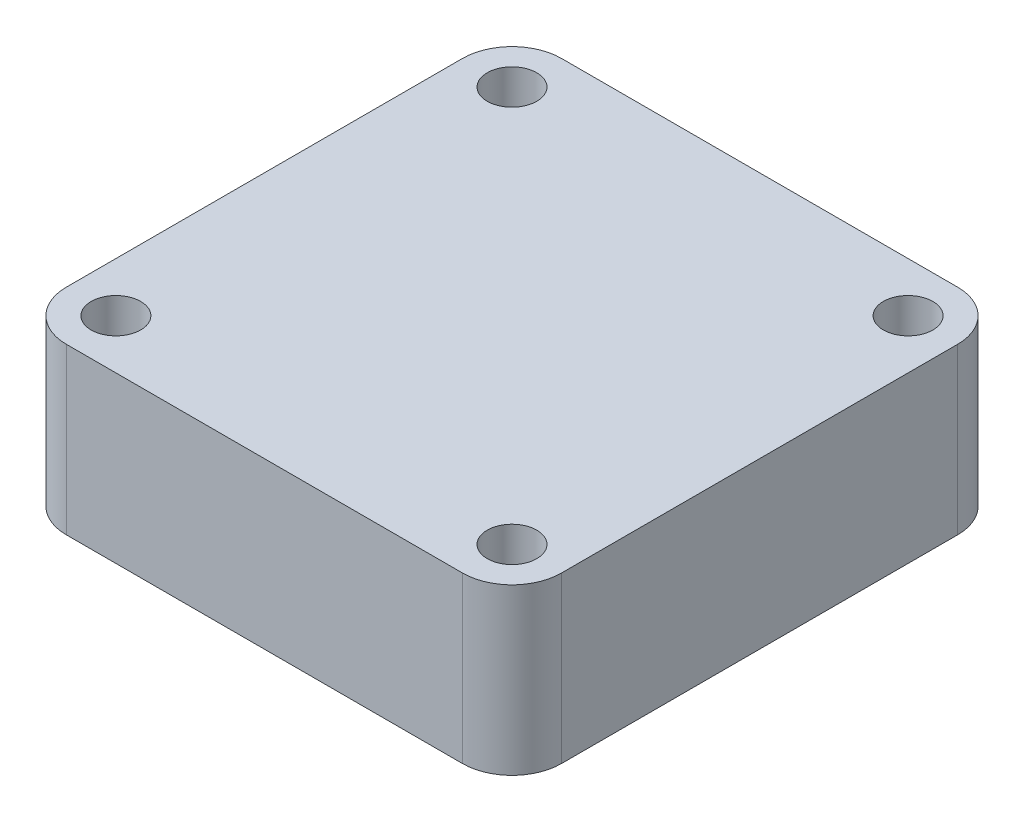
ISO-10303-21;
HEADER;
FILE_DESCRIPTION(('STEP AP214'),'2;1');
FILE_NAME('part.step','',(''),(''),'','','');
FILE_SCHEMA(('AUTOMOTIVE_DESIGN { 1 0 10303 214 1 1 1 1 }'));
ENDSEC;
DATA;
#1=APPLICATION_CONTEXT('core data for automotive mechanical design processes');
#2=APPLICATION_PROTOCOL_DEFINITION('international standard','automotive_design',2000,#1);
#3=PRODUCT_CONTEXT('',#1,'mechanical');
#4=PRODUCT('Part','Part','',(#3));
#5=PRODUCT_RELATED_PRODUCT_CATEGORY('part','',(#4));
#6=PRODUCT_DEFINITION_FORMATION('','',#4);
#7=PRODUCT_DEFINITION_CONTEXT('part definition',#1,'design');
#8=PRODUCT_DEFINITION('design','',#6,#7);
#9=PRODUCT_DEFINITION_SHAPE('','',#8);
#10=(LENGTH_UNIT() NAMED_UNIT(*) SI_UNIT(.MILLI.,.METRE.));
#11=(NAMED_UNIT(*) PLANE_ANGLE_UNIT() SI_UNIT($,.RADIAN.));
#12=(NAMED_UNIT(*) SI_UNIT($,.STERADIAN.) SOLID_ANGLE_UNIT());
#13=UNCERTAINTY_MEASURE_WITH_UNIT(LENGTH_MEASURE(1.E-05),#10,'distance_accuracy_value','');
#14=(GEOMETRIC_REPRESENTATION_CONTEXT(3) GLOBAL_UNCERTAINTY_ASSIGNED_CONTEXT((#13)) GLOBAL_UNIT_ASSIGNED_CONTEXT((#10,
#11,#12)) REPRESENTATION_CONTEXT('',''));
#15=CARTESIAN_POINT('',(0.,0.,0.));
#16=DIRECTION('',(0.,0.,1.));
#17=DIRECTION('',(1.,0.,0.));
#18=AXIS2_PLACEMENT_3D('',#15,#16,#17);
#19=CARTESIAN_POINT('',(0.,10.,0.));
#20=DIRECTION('',(1.,0.,0.));
#21=DIRECTION('',(0.,0.,-1.));
#22=AXIS2_PLACEMENT_3D('',#19,#20,#21);
#23=PLANE('',#22);
#24=DIRECTION('',(0.,0.,1.));
#25=VECTOR('',#24,1.);
#26=CARTESIAN_POINT('',(0.,10.,0.));
#27=LINE('',#26,#25);
#28=CARTESIAN_POINT('',(0.,10.,3.));
#29=VERTEX_POINT('',#28);
#30=CARTESIAN_POINT('',(0.,10.,27.));
#31=VERTEX_POINT('',#30);
#32=EDGE_CURVE('E126',#29,#31,#27,.T.);
#33=ORIENTED_EDGE('',*,*,#32,.F.);
#34=DIRECTION('',(0.,-1.,0.));
#35=VECTOR('',#34,1.);
#36=CARTESIAN_POINT('',(0.,10.,3.));
#37=LINE('',#36,#35);
#38=CARTESIAN_POINT('',(0.,0.,3.));
#39=VERTEX_POINT('',#38);
#40=EDGE_CURVE('E11',#29,#39,#37,.T.);
#41=ORIENTED_EDGE('',*,*,#40,.T.);
#42=DIRECTION('',(0.,0.,1.));
#43=VECTOR('',#42,1.);
#44=CARTESIAN_POINT('',(0.,0.,0.));
#45=LINE('',#44,#43);
#46=CARTESIAN_POINT('',(0.,0.,27.));
#47=VERTEX_POINT('',#46);
#48=EDGE_CURVE('E157',#39,#47,#45,.T.);
#49=ORIENTED_EDGE('',*,*,#48,.T.);
#50=DIRECTION('',(0.,-1.,0.));
#51=VECTOR('',#50,1.);
#52=CARTESIAN_POINT('',(0.,10.,27.));
#53=LINE('',#52,#51);
#54=EDGE_CURVE('E40',#47,#31,#53,.F.);
#55=ORIENTED_EDGE('',*,*,#54,.T.);
#56=EDGE_LOOP('',(#33,#41,#49,#55));
#57=FACE_BOUND('',#56,.T.);
#58=ADVANCED_FACE('F32',(#57),#23,.F.);
#59=CARTESIAN_POINT('',(0.,10.,30.));
#60=DIRECTION('',(0.,0.,-1.));
#61=DIRECTION('',(-1.,0.,0.));
#62=AXIS2_PLACEMENT_3D('',#59,#60,#61);
#63=PLANE('',#62);
#64=DIRECTION('',(1.,0.,0.));
#65=VECTOR('',#64,1.);
#66=CARTESIAN_POINT('',(0.,0.,30.));
#67=LINE('',#66,#65);
#68=CARTESIAN_POINT('',(3.,0.,30.));
#69=VERTEX_POINT('',#68);
#70=CARTESIAN_POINT('',(27.,0.,30.));
#71=VERTEX_POINT('',#70);
#72=EDGE_CURVE('E131',#69,#71,#67,.T.);
#73=ORIENTED_EDGE('',*,*,#72,.T.);
#74=DIRECTION('',(0.,-1.,0.));
#75=VECTOR('',#74,1.);
#76=CARTESIAN_POINT('',(27.,10.,30.));
#77=LINE('',#76,#75);
#78=CARTESIAN_POINT('',(27.,10.,30.));
#79=VERTEX_POINT('',#78);
#80=EDGE_CURVE('E47',#71,#79,#77,.F.);
#81=ORIENTED_EDGE('',*,*,#80,.T.);
#82=DIRECTION('',(1.,0.,0.));
#83=VECTOR('',#82,1.);
#84=CARTESIAN_POINT('',(0.,10.,30.));
#85=LINE('',#84,#83);
#86=CARTESIAN_POINT('',(3.,10.,30.));
#87=VERTEX_POINT('',#86);
#88=EDGE_CURVE('E129',#87,#79,#85,.T.);
#89=ORIENTED_EDGE('',*,*,#88,.F.);
#90=DIRECTION('',(0.,-1.,0.));
#91=VECTOR('',#90,1.);
#92=CARTESIAN_POINT('',(3.,10.,30.));
#93=LINE('',#92,#91);
#94=EDGE_CURVE('E149',#87,#69,#93,.T.);
#95=ORIENTED_EDGE('',*,*,#94,.T.);
#96=EDGE_LOOP('',(#73,#81,#89,#95));
#97=FACE_BOUND('',#96,.T.);
#98=ADVANCED_FACE('F164',(#97),#63,.F.);
#99=CARTESIAN_POINT('',(30.,10.,0.));
#100=DIRECTION('',(-1.,0.,0.));
#101=DIRECTION('',(0.,0.,1.));
#102=AXIS2_PLACEMENT_3D('',#99,#100,#101);
#103=PLANE('',#102);
#104=DIRECTION('',(0.,0.,-1.));
#105=VECTOR('',#104,1.);
#106=CARTESIAN_POINT('',(30.,0.,0.));
#107=LINE('',#106,#105);
#108=CARTESIAN_POINT('',(30.,0.,27.));
#109=VERTEX_POINT('',#108);
#110=CARTESIAN_POINT('',(30.,0.,3.));
#111=VERTEX_POINT('',#110);
#112=EDGE_CURVE('E127',#109,#111,#107,.T.);
#113=ORIENTED_EDGE('',*,*,#112,.T.);
#114=DIRECTION('',(0.,-1.,0.));
#115=VECTOR('',#114,1.);
#116=CARTESIAN_POINT('',(30.,10.,3.));
#117=LINE('',#116,#115);
#118=CARTESIAN_POINT('',(30.,10.,3.));
#119=VERTEX_POINT('',#118);
#120=EDGE_CURVE('E104',#111,#119,#117,.F.);
#121=ORIENTED_EDGE('',*,*,#120,.T.);
#122=DIRECTION('',(0.,0.,-1.));
#123=VECTOR('',#122,1.);
#124=CARTESIAN_POINT('',(30.,10.,0.));
#125=LINE('',#124,#123);
#126=CARTESIAN_POINT('',(30.,10.,27.));
#127=VERTEX_POINT('',#126);
#128=EDGE_CURVE('E169',#127,#119,#125,.T.);
#129=ORIENTED_EDGE('',*,*,#128,.F.);
#130=DIRECTION('',(0.,-1.,0.));
#131=VECTOR('',#130,1.);
#132=CARTESIAN_POINT('',(30.,10.,27.));
#133=LINE('',#132,#131);
#134=EDGE_CURVE('E109',#127,#109,#133,.T.);
#135=ORIENTED_EDGE('',*,*,#134,.T.);
#136=EDGE_LOOP('',(#113,#121,#129,#135));
#137=FACE_BOUND('',#136,.T.);
#138=ADVANCED_FACE('F232',(#137),#103,.F.);
#139=CARTESIAN_POINT('',(0.,10.,0.));
#140=DIRECTION('',(0.,0.,1.));
#141=DIRECTION('',(1.,0.,0.));
#142=AXIS2_PLACEMENT_3D('',#139,#140,#141);
#143=PLANE('',#142);
#144=DIRECTION('',(-1.,0.,0.));
#145=VECTOR('',#144,1.);
#146=CARTESIAN_POINT('',(0.,10.,0.));
#147=LINE('',#146,#145);
#148=CARTESIAN_POINT('',(27.,10.,0.));
#149=VERTEX_POINT('',#148);
#150=CARTESIAN_POINT('',(3.,10.,0.));
#151=VERTEX_POINT('',#150);
#152=EDGE_CURVE('E119',#149,#151,#147,.T.);
#153=ORIENTED_EDGE('',*,*,#152,.F.);
#154=DIRECTION('',(0.,-1.,0.));
#155=VECTOR('',#154,1.);
#156=CARTESIAN_POINT('',(27.,10.,0.));
#157=LINE('',#156,#155);
#158=CARTESIAN_POINT('',(27.,0.,0.));
#159=VERTEX_POINT('',#158);
#160=EDGE_CURVE('E103',#149,#159,#157,.T.);
#161=ORIENTED_EDGE('',*,*,#160,.T.);
#162=DIRECTION('',(-1.,0.,0.));
#163=VECTOR('',#162,1.);
#164=CARTESIAN_POINT('',(0.,0.,0.));
#165=LINE('',#164,#163);
#166=CARTESIAN_POINT('',(3.,0.,0.));
#167=VERTEX_POINT('',#166);
#168=EDGE_CURVE('E116',#159,#167,#165,.T.);
#169=ORIENTED_EDGE('',*,*,#168,.T.);
#170=DIRECTION('',(0.,-1.,0.));
#171=VECTOR('',#170,1.);
#172=CARTESIAN_POINT('',(3.,10.,0.));
#173=LINE('',#172,#171);
#174=EDGE_CURVE('E121',#167,#151,#173,.F.);
#175=ORIENTED_EDGE('',*,*,#174,.T.);
#176=EDGE_LOOP('',(#153,#161,#169,#175));
#177=FACE_BOUND('',#176,.T.);
#178=ADVANCED_FACE('F115',(#177),#143,.F.);
#179=CARTESIAN_POINT('',(0.,10.,0.));
#180=DIRECTION('',(0.,1.,0.));
#181=DIRECTION('',(0.,0.,1.));
#182=AXIS2_PLACEMENT_3D('',#179,#180,#181);
#183=PLANE('',#182);
#184=CARTESIAN_POINT('',(27.,10.,3.));
#185=DIRECTION('',(0.,1.,0.));
#186=DIRECTION('',(0.,0.,1.));
#187=AXIS2_PLACEMENT_3D('',#184,#185,#186);
#188=CIRCLE('',#187,1.5);
#189=CARTESIAN_POINT('',(27.,10.,4.5));
#190=VERTEX_POINT('',#189);
#191=EDGE_CURVE('E190',#190,#190,#188,.T.);
#192=ORIENTED_EDGE('',*,*,#191,.F.);
#193=EDGE_LOOP('',(#192));
#194=FACE_BOUND('',#193,.T.);
#195=CARTESIAN_POINT('',(27.0000000000002,10.,27.));
#196=DIRECTION('',(0.,1.,0.));
#197=DIRECTION('',(0.,0.,1.));
#198=AXIS2_PLACEMENT_3D('',#195,#196,#197);
#199=CIRCLE('',#198,1.5);
#200=CARTESIAN_POINT('',(27.0000000000002,10.,28.5));
#201=VERTEX_POINT('',#200);
#202=EDGE_CURVE('E184',#201,#201,#199,.T.);
#203=ORIENTED_EDGE('',*,*,#202,.F.);
#204=EDGE_LOOP('',(#203));
#205=FACE_BOUND('',#204,.T.);
#206=CARTESIAN_POINT('',(3.00000000000025,10.,27.));
#207=DIRECTION('',(0.,1.,0.));
#208=DIRECTION('',(0.,0.,1.));
#209=AXIS2_PLACEMENT_3D('',#206,#207,#208);
#210=CIRCLE('',#209,1.5);
#211=CARTESIAN_POINT('',(3.00000000000025,10.,28.5));
#212=VERTEX_POINT('',#211);
#213=EDGE_CURVE('E178',#212,#212,#210,.T.);
#214=ORIENTED_EDGE('',*,*,#213,.F.);
#215=EDGE_LOOP('',(#214));
#216=FACE_BOUND('',#215,.T.);
#217=CARTESIAN_POINT('',(3.,10.,3.));
#218=DIRECTION('',(0.,1.,0.));
#219=DIRECTION('',(0.,0.,1.));
#220=AXIS2_PLACEMENT_3D('',#217,#218,#219);
#221=CIRCLE('',#220,1.5);
#222=CARTESIAN_POINT('',(3.,10.,4.5));
#223=VERTEX_POINT('',#222);
#224=EDGE_CURVE('E172',#223,#223,#221,.T.);
#225=ORIENTED_EDGE('',*,*,#224,.F.);
#226=EDGE_LOOP('',(#225));
#227=FACE_BOUND('',#226,.T.);
#228=ORIENTED_EDGE('',*,*,#128,.T.);
#229=CARTESIAN_POINT('',(27.,10.,3.));
#230=DIRECTION('',(0.,1.,0.));
#231=DIRECTION('',(0.,0.,1.));
#232=AXIS2_PLACEMENT_3D('',#229,#230,#231);
#233=CIRCLE('',#232,3.);
#234=EDGE_CURVE('E147',#119,#149,#233,.T.);
#235=ORIENTED_EDGE('',*,*,#234,.T.);
#236=ORIENTED_EDGE('',*,*,#152,.T.);
#237=CARTESIAN_POINT('',(3.,10.,3.));
#238=DIRECTION('',(0.,1.,0.));
#239=DIRECTION('',(0.,0.,1.));
#240=AXIS2_PLACEMENT_3D('',#237,#238,#239);
#241=CIRCLE('',#240,3.);
#242=EDGE_CURVE('E143',#151,#29,#241,.T.);
#243=ORIENTED_EDGE('',*,*,#242,.T.);
#244=ORIENTED_EDGE('',*,*,#32,.T.);
#245=CARTESIAN_POINT('',(3.,10.,27.));
#246=DIRECTION('',(0.,1.,0.));
#247=DIRECTION('',(0.,0.,1.));
#248=AXIS2_PLACEMENT_3D('',#245,#246,#247);
#249=CIRCLE('',#248,3.);
#250=EDGE_CURVE('E54',#31,#87,#249,.T.);
#251=ORIENTED_EDGE('',*,*,#250,.T.);
#252=ORIENTED_EDGE('',*,*,#88,.T.);
#253=CARTESIAN_POINT('',(27.,10.,27.));
#254=DIRECTION('',(0.,1.,0.));
#255=DIRECTION('',(0.,0.,1.));
#256=AXIS2_PLACEMENT_3D('',#253,#254,#255);
#257=CIRCLE('',#256,3.);
#258=EDGE_CURVE('E145',#79,#127,#257,.T.);
#259=ORIENTED_EDGE('',*,*,#258,.T.);
#260=EDGE_LOOP('',(#228,#235,#236,#243,#244,#251,#252,#259));
#261=FACE_BOUND('',#260,.T.);
#262=ADVANCED_FACE('F160',(#194,#205,#216,#227,#261),#183,.T.);
#263=CARTESIAN_POINT('',(0.,0.,0.));
#264=DIRECTION('',(0.,1.,0.));
#265=DIRECTION('',(0.,0.,1.));
#266=AXIS2_PLACEMENT_3D('',#263,#264,#265);
#267=PLANE('',#266);
#268=CARTESIAN_POINT('',(27.,0.,3.));
#269=DIRECTION('',(0.,1.,0.));
#270=DIRECTION('',(0.,0.,1.));
#271=AXIS2_PLACEMENT_3D('',#268,#269,#270);
#272=CIRCLE('',#271,1.5);
#273=CARTESIAN_POINT('',(27.,0.,4.5));
#274=VERTEX_POINT('',#273);
#275=EDGE_CURVE('E175',#274,#274,#272,.T.);
#276=ORIENTED_EDGE('',*,*,#275,.T.);
#277=EDGE_LOOP('',(#276));
#278=FACE_BOUND('',#277,.T.);
#279=CARTESIAN_POINT('',(27.0000000000002,0.,27.));
#280=DIRECTION('',(0.,1.,0.));
#281=DIRECTION('',(0.,0.,1.));
#282=AXIS2_PLACEMENT_3D('',#279,#280,#281);
#283=CIRCLE('',#282,1.5);
#284=CARTESIAN_POINT('',(27.0000000000002,0.,28.5));
#285=VERTEX_POINT('',#284);
#286=EDGE_CURVE('E187',#285,#285,#283,.T.);
#287=ORIENTED_EDGE('',*,*,#286,.T.);
#288=EDGE_LOOP('',(#287));
#289=FACE_BOUND('',#288,.T.);
#290=CARTESIAN_POINT('',(3.00000000000025,0.,27.));
#291=DIRECTION('',(0.,1.,0.));
#292=DIRECTION('',(0.,0.,1.));
#293=AXIS2_PLACEMENT_3D('',#290,#291,#292);
#294=CIRCLE('',#293,1.5);
#295=CARTESIAN_POINT('',(3.00000000000025,0.,28.5));
#296=VERTEX_POINT('',#295);
#297=EDGE_CURVE('E181',#296,#296,#294,.T.);
#298=ORIENTED_EDGE('',*,*,#297,.T.);
#299=EDGE_LOOP('',(#298));
#300=FACE_BOUND('',#299,.T.);
#301=CARTESIAN_POINT('',(3.,0.,3.));
#302=DIRECTION('',(0.,1.,0.));
#303=DIRECTION('',(0.,0.,1.));
#304=AXIS2_PLACEMENT_3D('',#301,#302,#303);
#305=CIRCLE('',#304,1.5);
#306=CARTESIAN_POINT('',(3.,0.,4.5));
#307=VERTEX_POINT('',#306);
#308=EDGE_CURVE('E165',#307,#307,#305,.T.);
#309=ORIENTED_EDGE('',*,*,#308,.T.);
#310=EDGE_LOOP('',(#309));
#311=FACE_BOUND('',#310,.T.);
#312=ORIENTED_EDGE('',*,*,#168,.F.);
#313=CARTESIAN_POINT('',(27.,0.,3.));
#314=DIRECTION('',(0.,1.,0.));
#315=DIRECTION('',(0.,0.,1.));
#316=AXIS2_PLACEMENT_3D('',#313,#314,#315);
#317=CIRCLE('',#316,3.);
#318=EDGE_CURVE('E99',#159,#111,#317,.F.);
#319=ORIENTED_EDGE('',*,*,#318,.T.);
#320=ORIENTED_EDGE('',*,*,#112,.F.);
#321=CARTESIAN_POINT('',(27.,0.,27.));
#322=DIRECTION('',(0.,1.,0.));
#323=DIRECTION('',(0.,0.,1.));
#324=AXIS2_PLACEMENT_3D('',#321,#322,#323);
#325=CIRCLE('',#324,3.);
#326=EDGE_CURVE('E110',#109,#71,#325,.F.);
#327=ORIENTED_EDGE('',*,*,#326,.T.);
#328=ORIENTED_EDGE('',*,*,#72,.F.);
#329=CARTESIAN_POINT('',(3.,0.,27.));
#330=DIRECTION('',(0.,1.,0.));
#331=DIRECTION('',(0.,0.,1.));
#332=AXIS2_PLACEMENT_3D('',#329,#330,#331);
#333=CIRCLE('',#332,3.);
#334=EDGE_CURVE('E120',#69,#47,#333,.F.);
#335=ORIENTED_EDGE('',*,*,#334,.T.);
#336=ORIENTED_EDGE('',*,*,#48,.F.);
#337=CARTESIAN_POINT('',(3.,0.,3.));
#338=DIRECTION('',(0.,1.,0.));
#339=DIRECTION('',(0.,0.,1.));
#340=AXIS2_PLACEMENT_3D('',#337,#338,#339);
#341=CIRCLE('',#340,3.);
#342=EDGE_CURVE('E125',#39,#167,#341,.F.);
#343=ORIENTED_EDGE('',*,*,#342,.T.);
#344=EDGE_LOOP('',(#312,#319,#320,#327,#328,#335,#336,#343));
#345=FACE_BOUND('',#344,.T.);
#346=ADVANCED_FACE('F123',(#278,#289,#300,#311,#345),#267,.F.);
#347=CARTESIAN_POINT('',(3.,0.,3.));
#348=DIRECTION('',(0.,1.,0.));
#349=DIRECTION('',(0.,0.,1.));
#350=AXIS2_PLACEMENT_3D('',#347,#348,#349);
#351=CYLINDRICAL_SURFACE('',#350,1.5);
#352=ORIENTED_EDGE('',*,*,#308,.F.);
#353=EDGE_LOOP('',(#352));
#354=FACE_BOUND('',#353,.T.);
#355=ORIENTED_EDGE('',*,*,#224,.T.);
#356=EDGE_LOOP('',(#355));
#357=FACE_BOUND('',#356,.T.);
#358=ADVANCED_FACE('F214',(#354,#357),#351,.F.);
#359=CARTESIAN_POINT('',(3.00000000000025,0.,27.));
#360=DIRECTION('',(0.,1.,0.));
#361=DIRECTION('',(0.,0.,1.));
#362=AXIS2_PLACEMENT_3D('',#359,#360,#361);
#363=CYLINDRICAL_SURFACE('',#362,1.5);
#364=ORIENTED_EDGE('',*,*,#297,.F.);
#365=EDGE_LOOP('',(#364));
#366=FACE_BOUND('',#365,.T.);
#367=ORIENTED_EDGE('',*,*,#213,.T.);
#368=EDGE_LOOP('',(#367));
#369=FACE_BOUND('',#368,.T.);
#370=ADVANCED_FACE('F216',(#366,#369),#363,.F.);
#371=CARTESIAN_POINT('',(27.0000000000002,0.,27.));
#372=DIRECTION('',(0.,1.,0.));
#373=DIRECTION('',(0.,0.,1.));
#374=AXIS2_PLACEMENT_3D('',#371,#372,#373);
#375=CYLINDRICAL_SURFACE('',#374,1.5);
#376=ORIENTED_EDGE('',*,*,#286,.F.);
#377=EDGE_LOOP('',(#376));
#378=FACE_BOUND('',#377,.T.);
#379=ORIENTED_EDGE('',*,*,#202,.T.);
#380=EDGE_LOOP('',(#379));
#381=FACE_BOUND('',#380,.T.);
#382=ADVANCED_FACE('F201',(#378,#381),#375,.F.);
#383=CARTESIAN_POINT('',(27.,0.,3.));
#384=DIRECTION('',(0.,1.,0.));
#385=DIRECTION('',(0.,0.,1.));
#386=AXIS2_PLACEMENT_3D('',#383,#384,#385);
#387=CYLINDRICAL_SURFACE('',#386,1.5);
#388=ORIENTED_EDGE('',*,*,#275,.F.);
#389=EDGE_LOOP('',(#388));
#390=FACE_BOUND('',#389,.T.);
#391=ORIENTED_EDGE('',*,*,#191,.T.);
#392=EDGE_LOOP('',(#391));
#393=FACE_BOUND('',#392,.T.);
#394=ADVANCED_FACE('F198',(#390,#393),#387,.F.);
#395=CARTESIAN_POINT('',(27.,10.,3.));
#396=DIRECTION('',(0.,-1.,0.));
#397=DIRECTION('',(0.,0.,-1.));
#398=AXIS2_PLACEMENT_3D('',#395,#396,#397);
#399=CYLINDRICAL_SURFACE('',#398,3.);
#400=ORIENTED_EDGE('',*,*,#234,.F.);
#401=ORIENTED_EDGE('',*,*,#120,.F.);
#402=ORIENTED_EDGE('',*,*,#318,.F.);
#403=ORIENTED_EDGE('',*,*,#160,.F.);
#404=EDGE_LOOP('',(#400,#401,#402,#403));
#405=FACE_BOUND('',#404,.T.);
#406=ADVANCED_FACE('F102',(#405),#399,.T.);
#407=CARTESIAN_POINT('',(27.,10.,27.));
#408=DIRECTION('',(0.,-1.,0.));
#409=DIRECTION('',(0.,0.,-1.));
#410=AXIS2_PLACEMENT_3D('',#407,#408,#409);
#411=CYLINDRICAL_SURFACE('',#410,3.);
#412=ORIENTED_EDGE('',*,*,#258,.F.);
#413=ORIENTED_EDGE('',*,*,#80,.F.);
#414=ORIENTED_EDGE('',*,*,#326,.F.);
#415=ORIENTED_EDGE('',*,*,#134,.F.);
#416=EDGE_LOOP('',(#412,#413,#414,#415));
#417=FACE_BOUND('',#416,.T.);
#418=ADVANCED_FACE('F238',(#417),#411,.T.);
#419=CARTESIAN_POINT('',(3.,10.,3.));
#420=DIRECTION('',(0.,-1.,0.));
#421=DIRECTION('',(0.,0.,-1.));
#422=AXIS2_PLACEMENT_3D('',#419,#420,#421);
#423=CYLINDRICAL_SURFACE('',#422,3.);
#424=ORIENTED_EDGE('',*,*,#242,.F.);
#425=ORIENTED_EDGE('',*,*,#174,.F.);
#426=ORIENTED_EDGE('',*,*,#342,.F.);
#427=ORIENTED_EDGE('',*,*,#40,.F.);
#428=EDGE_LOOP('',(#424,#425,#426,#427));
#429=FACE_BOUND('',#428,.T.);
#430=ADVANCED_FACE('F240',(#429),#423,.T.);
#431=CARTESIAN_POINT('',(3.,10.,27.));
#432=DIRECTION('',(0.,-1.,0.));
#433=DIRECTION('',(0.,0.,-1.));
#434=AXIS2_PLACEMENT_3D('',#431,#432,#433);
#435=CYLINDRICAL_SURFACE('',#434,3.);
#436=ORIENTED_EDGE('',*,*,#250,.F.);
#437=ORIENTED_EDGE('',*,*,#54,.F.);
#438=ORIENTED_EDGE('',*,*,#334,.F.);
#439=ORIENTED_EDGE('',*,*,#94,.F.);
#440=EDGE_LOOP('',(#436,#437,#438,#439));
#441=FACE_BOUND('',#440,.T.);
#442=ADVANCED_FACE('F34',(#441),#435,.T.);
#443=CLOSED_SHELL('',(#58,#98,#138,#178,#262,#346,#358,#370,#382,#394,#406,#418,#430,#442));
#444=MANIFOLD_SOLID_BREP('B2',#443);
#445=ADVANCED_BREP_SHAPE_REPRESENTATION('',(#18,#444),#14);
#446=SHAPE_DEFINITION_REPRESENTATION(#9,#445);
ENDSEC;
END-ISO-10303-21;
